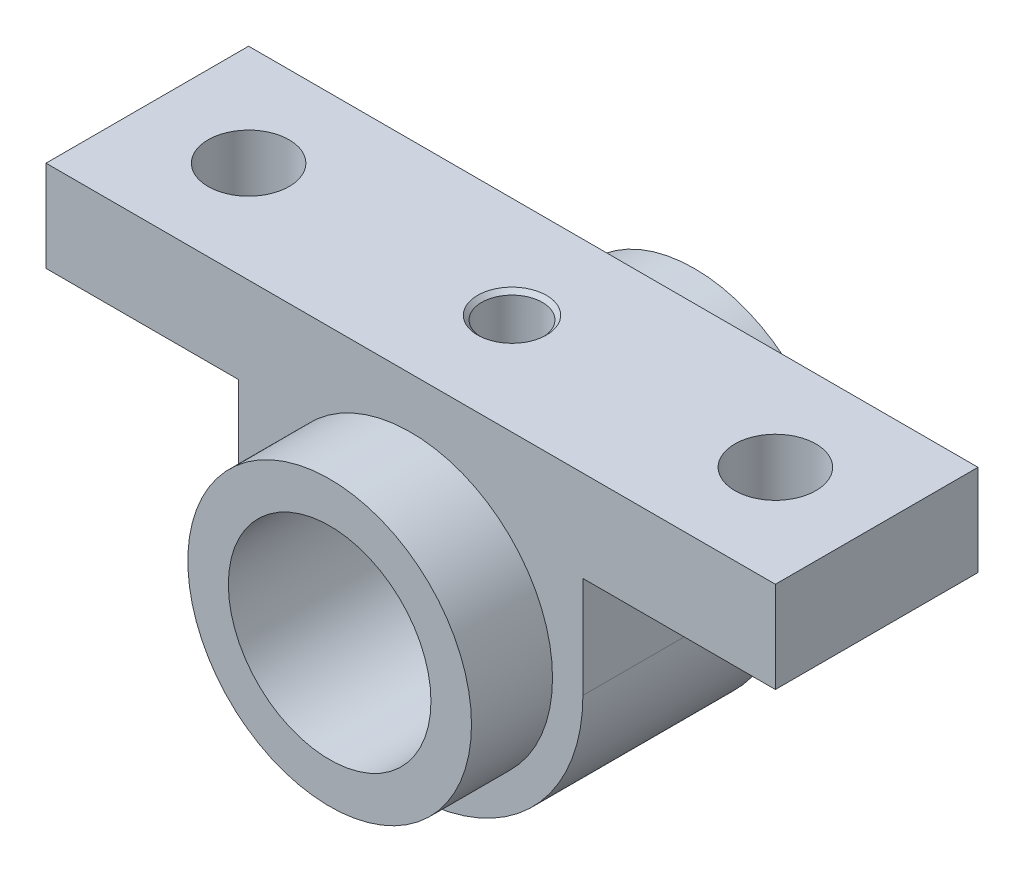
ISO-10303-21;
HEADER;
FILE_DESCRIPTION(('STEP AP214'),'2;1');
FILE_NAME('part.step','',(''),(''),'','','');
FILE_SCHEMA(('AUTOMOTIVE_DESIGN { 1 0 10303 214 1 1 1 1 }'));
ENDSEC;
DATA;
#1=APPLICATION_CONTEXT('core data for automotive mechanical design processes');
#2=APPLICATION_PROTOCOL_DEFINITION('international standard','automotive_design',2000,#1);
#3=PRODUCT_CONTEXT('',#1,'mechanical');
#4=PRODUCT('Part','Part','',(#3));
#5=PRODUCT_RELATED_PRODUCT_CATEGORY('part','',(#4));
#6=PRODUCT_DEFINITION_FORMATION('','',#4);
#7=PRODUCT_DEFINITION_CONTEXT('part definition',#1,'design');
#8=PRODUCT_DEFINITION('design','',#6,#7);
#9=PRODUCT_DEFINITION_SHAPE('','',#8);
#10=(LENGTH_UNIT() NAMED_UNIT(*) SI_UNIT(.MILLI.,.METRE.));
#11=(NAMED_UNIT(*) PLANE_ANGLE_UNIT() SI_UNIT($,.RADIAN.));
#12=(NAMED_UNIT(*) SI_UNIT($,.STERADIAN.) SOLID_ANGLE_UNIT());
#13=UNCERTAINTY_MEASURE_WITH_UNIT(LENGTH_MEASURE(1.E-05),#10,'distance_accuracy_value','');
#14=(GEOMETRIC_REPRESENTATION_CONTEXT(3) GLOBAL_UNCERTAINTY_ASSIGNED_CONTEXT((#13)) GLOBAL_UNIT_ASSIGNED_CONTEXT((#10,
#11,#12)) REPRESENTATION_CONTEXT('',''));
#15=CARTESIAN_POINT('',(0.,0.,0.));
#16=DIRECTION('',(0.,0.,1.));
#17=DIRECTION('',(1.,0.,0.));
#18=AXIS2_PLACEMENT_3D('',#15,#16,#17);
#19=CARTESIAN_POINT('',(18.,-9.5,0.));
#20=DIRECTION('',(0.,0.,1.));
#21=DIRECTION('',(1.,0.,0.));
#22=AXIS2_PLACEMENT_3D('',#19,#20,#21);
#23=PLANE('',#22);
#24=DIRECTION('',(0.,-1.,0.));
#25=VECTOR('',#24,1.);
#26=CARTESIAN_POINT('',(0.,0.,0.));
#27=LINE('',#26,#25);
#28=CARTESIAN_POINT('',(0.,0.,0.));
#29=VERTEX_POINT('',#28);
#30=CARTESIAN_POINT('',(0.,-4.5,0.));
#31=VERTEX_POINT('',#30);
#32=EDGE_CURVE('E143',#29,#31,#27,.T.);
#33=ORIENTED_EDGE('',*,*,#32,.F.);
#34=DIRECTION('',(-1.,0.,0.));
#35=VECTOR('',#34,1.);
#36=CARTESIAN_POINT('',(0.,0.,0.));
#37=LINE('',#36,#35);
#38=CARTESIAN_POINT('',(36.,0.,0.));
#39=VERTEX_POINT('',#38);
#40=EDGE_CURVE('E92',#39,#29,#37,.T.);
#41=ORIENTED_EDGE('',*,*,#40,.F.);
#42=DIRECTION('',(0.,1.,0.));
#43=VECTOR('',#42,1.);
#44=CARTESIAN_POINT('',(36.,0.,0.));
#45=LINE('',#44,#43);
#46=CARTESIAN_POINT('',(36.,-4.5,0.));
#47=VERTEX_POINT('',#46);
#48=EDGE_CURVE('E86',#47,#39,#45,.T.);
#49=ORIENTED_EDGE('',*,*,#48,.F.);
#50=DIRECTION('',(1.,0.,0.));
#51=VECTOR('',#50,1.);
#52=CARTESIAN_POINT('',(26.5,-4.5,0.));
#53=LINE('',#52,#51);
#54=CARTESIAN_POINT('',(26.5,-4.5,0.));
#55=VERTEX_POINT('',#54);
#56=EDGE_CURVE('E130',#55,#47,#53,.T.);
#57=ORIENTED_EDGE('',*,*,#56,.F.);
#58=DIRECTION('',(0.,1.,0.));
#59=VECTOR('',#58,1.);
#60=CARTESIAN_POINT('',(26.5,-9.5,0.));
#61=LINE('',#60,#59);
#62=CARTESIAN_POINT('',(26.5,-9.5,0.));
#63=VERTEX_POINT('',#62);
#64=EDGE_CURVE('E157',#63,#55,#61,.T.);
#65=ORIENTED_EDGE('',*,*,#64,.F.);
#66=CARTESIAN_POINT('',(18.,-9.5,0.));
#67=DIRECTION('',(0.,0.,1.));
#68=DIRECTION('',(1.,0.,0.));
#69=AXIS2_PLACEMENT_3D('',#66,#67,#68);
#70=CIRCLE('',#69,8.5);
#71=CARTESIAN_POINT('',(9.5,-9.5,0.));
#72=VERTEX_POINT('',#71);
#73=EDGE_CURVE('E154',#72,#63,#70,.T.);
#74=ORIENTED_EDGE('',*,*,#73,.F.);
#75=DIRECTION('',(0.,-1.,0.));
#76=VECTOR('',#75,1.);
#77=CARTESIAN_POINT('',(9.5,-4.5,0.));
#78=LINE('',#77,#76);
#79=CARTESIAN_POINT('',(9.5,-4.5,0.));
#80=VERTEX_POINT('',#79);
#81=EDGE_CURVE('E151',#80,#72,#78,.T.);
#82=ORIENTED_EDGE('',*,*,#81,.F.);
#83=DIRECTION('',(1.,0.,0.));
#84=VECTOR('',#83,1.);
#85=CARTESIAN_POINT('',(0.,-4.5,0.));
#86=LINE('',#85,#84);
#87=EDGE_CURVE('E147',#31,#80,#86,.T.);
#88=ORIENTED_EDGE('',*,*,#87,.F.);
#89=EDGE_LOOP('',(#33,#41,#49,#57,#65,#74,#82,#88));
#90=FACE_BOUND('',#89,.T.);
#91=CARTESIAN_POINT('',(18.,-9.5,0.));
#92=DIRECTION('',(0.,0.,1.));
#93=DIRECTION('',(1.,0.,0.));
#94=AXIS2_PLACEMENT_3D('',#91,#92,#93);
#95=CIRCLE('',#94,7.);
#96=CARTESIAN_POINT('',(25.,-9.5,0.));
#97=VERTEX_POINT('',#96);
#98=EDGE_CURVE('E188',#97,#97,#95,.F.);
#99=ORIENTED_EDGE('',*,*,#98,.F.);
#100=EDGE_LOOP('',(#99));
#101=FACE_BOUND('',#100,.T.);
#102=ADVANCED_FACE('F39',(#90,#101),#23,.F.);
#103=CARTESIAN_POINT('',(18.,-9.5,10.));
#104=DIRECTION('',(0.,0.,1.));
#105=DIRECTION('',(1.,0.,0.));
#106=AXIS2_PLACEMENT_3D('',#103,#104,#105);
#107=PLANE('',#106);
#108=DIRECTION('',(0.,-1.,0.));
#109=VECTOR('',#108,1.);
#110=CARTESIAN_POINT('',(0.,0.,10.));
#111=LINE('',#110,#109);
#112=CARTESIAN_POINT('',(0.,0.,10.));
#113=VERTEX_POINT('',#112);
#114=CARTESIAN_POINT('',(0.,-4.5,10.));
#115=VERTEX_POINT('',#114);
#116=EDGE_CURVE('E166',#113,#115,#111,.T.);
#117=ORIENTED_EDGE('',*,*,#116,.T.);
#118=DIRECTION('',(1.,0.,0.));
#119=VECTOR('',#118,1.);
#120=CARTESIAN_POINT('',(0.,-4.5,10.));
#121=LINE('',#120,#119);
#122=CARTESIAN_POINT('',(9.5,-4.5,10.));
#123=VERTEX_POINT('',#122);
#124=EDGE_CURVE('E101',#115,#123,#121,.T.);
#125=ORIENTED_EDGE('',*,*,#124,.T.);
#126=DIRECTION('',(0.,-1.,0.));
#127=VECTOR('',#126,1.);
#128=CARTESIAN_POINT('',(9.5,-4.5,10.));
#129=LINE('',#128,#127);
#130=CARTESIAN_POINT('',(9.5,-9.5,10.));
#131=VERTEX_POINT('',#130);
#132=EDGE_CURVE('E277',#123,#131,#129,.T.);
#133=ORIENTED_EDGE('',*,*,#132,.T.);
#134=CARTESIAN_POINT('',(18.,-9.5,10.));
#135=DIRECTION('',(0.,0.,1.));
#136=DIRECTION('',(1.,0.,0.));
#137=AXIS2_PLACEMENT_3D('',#134,#135,#136);
#138=CIRCLE('',#137,8.5);
#139=CARTESIAN_POINT('',(26.5,-9.5,10.));
#140=VERTEX_POINT('',#139);
#141=EDGE_CURVE('E280',#131,#140,#138,.T.);
#142=ORIENTED_EDGE('',*,*,#141,.T.);
#143=DIRECTION('',(0.,1.,0.));
#144=VECTOR('',#143,1.);
#145=CARTESIAN_POINT('',(26.5,-9.5,10.));
#146=LINE('',#145,#144);
#147=CARTESIAN_POINT('',(26.5,-4.5,10.));
#148=VERTEX_POINT('',#147);
#149=EDGE_CURVE('E121',#140,#148,#146,.T.);
#150=ORIENTED_EDGE('',*,*,#149,.T.);
#151=DIRECTION('',(1.,0.,0.));
#152=VECTOR('',#151,1.);
#153=CARTESIAN_POINT('',(26.5,-4.5,10.));
#154=LINE('',#153,#152);
#155=CARTESIAN_POINT('',(36.,-4.5,10.));
#156=VERTEX_POINT('',#155);
#157=EDGE_CURVE('E114',#148,#156,#154,.T.);
#158=ORIENTED_EDGE('',*,*,#157,.T.);
#159=DIRECTION('',(0.,1.,0.));
#160=VECTOR('',#159,1.);
#161=CARTESIAN_POINT('',(36.,0.,10.));
#162=LINE('',#161,#160);
#163=CARTESIAN_POINT('',(36.,0.,10.));
#164=VERTEX_POINT('',#163);
#165=EDGE_CURVE('E119',#156,#164,#162,.T.);
#166=ORIENTED_EDGE('',*,*,#165,.T.);
#167=DIRECTION('',(-1.,0.,0.));
#168=VECTOR('',#167,1.);
#169=CARTESIAN_POINT('',(0.,0.,10.));
#170=LINE('',#169,#168);
#171=EDGE_CURVE('E57',#164,#113,#170,.T.);
#172=ORIENTED_EDGE('',*,*,#171,.T.);
#173=EDGE_LOOP('',(#117,#125,#133,#142,#150,#158,#166,#172));
#174=FACE_BOUND('',#173,.T.);
#175=CARTESIAN_POINT('',(18.,-9.5,10.));
#176=DIRECTION('',(0.,0.,1.));
#177=DIRECTION('',(1.,0.,0.));
#178=AXIS2_PLACEMENT_3D('',#175,#176,#177);
#179=CIRCLE('',#178,7.);
#180=CARTESIAN_POINT('',(25.,-9.5,10.));
#181=VERTEX_POINT('',#180);
#182=EDGE_CURVE('E290',#181,#181,#179,.T.);
#183=ORIENTED_EDGE('',*,*,#182,.F.);
#184=EDGE_LOOP('',(#183));
#185=FACE_BOUND('',#184,.T.);
#186=ADVANCED_FACE('F116',(#174,#185),#107,.T.);
#187=CARTESIAN_POINT('',(0.,0.,10.));
#188=DIRECTION('',(1.,0.,0.));
#189=DIRECTION('',(0.,1.,0.));
#190=AXIS2_PLACEMENT_3D('',#187,#188,#189);
#191=PLANE('',#190);
#192=ORIENTED_EDGE('',*,*,#32,.T.);
#193=DIRECTION('',(0.,0.,-1.));
#194=VECTOR('',#193,1.);
#195=CARTESIAN_POINT('',(0.,-4.5,10.));
#196=LINE('',#195,#194);
#197=EDGE_CURVE('E185',#115,#31,#196,.T.);
#198=ORIENTED_EDGE('',*,*,#197,.F.);
#199=ORIENTED_EDGE('',*,*,#116,.F.);
#200=DIRECTION('',(0.,0.,-1.));
#201=VECTOR('',#200,1.);
#202=CARTESIAN_POINT('',(0.,0.,10.));
#203=LINE('',#202,#201);
#204=EDGE_CURVE('E139',#113,#29,#203,.T.);
#205=ORIENTED_EDGE('',*,*,#204,.T.);
#206=EDGE_LOOP('',(#192,#198,#199,#205));
#207=FACE_BOUND('',#206,.T.);
#208=ADVANCED_FACE('F239',(#207),#191,.F.);
#209=CARTESIAN_POINT('',(0.,-4.5,10.));
#210=DIRECTION('',(0.,1.,0.));
#211=DIRECTION('',(0.,0.,1.));
#212=AXIS2_PLACEMENT_3D('',#209,#210,#211);
#213=PLANE('',#212);
#214=CARTESIAN_POINT('',(5.,-4.5,5.));
#215=DIRECTION('',(0.,1.,0.));
#216=DIRECTION('',(0.,0.,1.));
#217=AXIS2_PLACEMENT_3D('',#214,#215,#216);
#218=CIRCLE('',#217,2.);
#219=CARTESIAN_POINT('',(5.,-4.5,7.));
#220=VERTEX_POINT('',#219);
#221=EDGE_CURVE('E200',#220,#220,#218,.T.);
#222=ORIENTED_EDGE('',*,*,#221,.T.);
#223=EDGE_LOOP('',(#222));
#224=FACE_BOUND('',#223,.T.);
#225=ORIENTED_EDGE('',*,*,#87,.T.);
#226=DIRECTION('',(0.,0.,-1.));
#227=VECTOR('',#226,1.);
#228=CARTESIAN_POINT('',(9.5,-4.5,10.));
#229=LINE('',#228,#227);
#230=EDGE_CURVE('E181',#123,#80,#229,.T.);
#231=ORIENTED_EDGE('',*,*,#230,.F.);
#232=ORIENTED_EDGE('',*,*,#124,.F.);
#233=ORIENTED_EDGE('',*,*,#197,.T.);
#234=EDGE_LOOP('',(#225,#231,#232,#233));
#235=FACE_BOUND('',#234,.T.);
#236=ADVANCED_FACE('F263',(#224,#235),#213,.F.);
#237=CARTESIAN_POINT('',(9.5,-4.5,10.));
#238=DIRECTION('',(1.,0.,0.));
#239=DIRECTION('',(0.,0.,-1.));
#240=AXIS2_PLACEMENT_3D('',#237,#238,#239);
#241=PLANE('',#240);
#242=ORIENTED_EDGE('',*,*,#81,.T.);
#243=DIRECTION('',(0.,0.,-1.));
#244=VECTOR('',#243,1.);
#245=CARTESIAN_POINT('',(9.5,-9.5,10.));
#246=LINE('',#245,#244);
#247=EDGE_CURVE('E177',#131,#72,#246,.T.);
#248=ORIENTED_EDGE('',*,*,#247,.F.);
#249=ORIENTED_EDGE('',*,*,#132,.F.);
#250=ORIENTED_EDGE('',*,*,#230,.T.);
#251=EDGE_LOOP('',(#242,#248,#249,#250));
#252=FACE_BOUND('',#251,.T.);
#253=ADVANCED_FACE('F259',(#252),#241,.F.);
#254=CARTESIAN_POINT('',(18.,-9.5,10.));
#255=DIRECTION('',(0.,0.,-1.));
#256=DIRECTION('',(-1.,0.,0.));
#257=AXIS2_PLACEMENT_3D('',#254,#255,#256);
#258=CYLINDRICAL_SURFACE('',#257,8.5);
#259=ORIENTED_EDGE('',*,*,#73,.T.);
#260=DIRECTION('',(0.,0.,-1.));
#261=VECTOR('',#260,1.);
#262=CARTESIAN_POINT('',(26.5,-9.5,10.));
#263=LINE('',#262,#261);
#264=EDGE_CURVE('E173',#140,#63,#263,.T.);
#265=ORIENTED_EDGE('',*,*,#264,.F.);
#266=ORIENTED_EDGE('',*,*,#141,.F.);
#267=ORIENTED_EDGE('',*,*,#247,.T.);
#268=EDGE_LOOP('',(#259,#265,#266,#267));
#269=FACE_BOUND('',#268,.T.);
#270=ADVANCED_FACE('F255',(#269),#258,.T.);
#271=CARTESIAN_POINT('',(26.5,-9.5,10.));
#272=DIRECTION('',(-1.,0.,0.));
#273=DIRECTION('',(0.,-1.,0.));
#274=AXIS2_PLACEMENT_3D('',#271,#272,#273);
#275=PLANE('',#274);
#276=ORIENTED_EDGE('',*,*,#64,.T.);
#277=DIRECTION('',(0.,0.,-1.));
#278=VECTOR('',#277,1.);
#279=CARTESIAN_POINT('',(26.5,-4.5,10.));
#280=LINE('',#279,#278);
#281=EDGE_CURVE('E132',#148,#55,#280,.T.);
#282=ORIENTED_EDGE('',*,*,#281,.F.);
#283=ORIENTED_EDGE('',*,*,#149,.F.);
#284=ORIENTED_EDGE('',*,*,#264,.T.);
#285=EDGE_LOOP('',(#276,#282,#283,#284));
#286=FACE_BOUND('',#285,.T.);
#287=ADVANCED_FACE('F251',(#286),#275,.F.);
#288=CARTESIAN_POINT('',(26.5,-4.5,10.));
#289=DIRECTION('',(0.,1.,0.));
#290=DIRECTION('',(0.,0.,1.));
#291=AXIS2_PLACEMENT_3D('',#288,#289,#290);
#292=PLANE('',#291);
#293=CARTESIAN_POINT('',(31.,-4.5,5.));
#294=DIRECTION('',(0.,1.,0.));
#295=DIRECTION('',(0.,0.,1.));
#296=AXIS2_PLACEMENT_3D('',#293,#294,#295);
#297=CIRCLE('',#296,2.);
#298=CARTESIAN_POINT('',(31.,-4.5,7.));
#299=VERTEX_POINT('',#298);
#300=EDGE_CURVE('E309',#299,#299,#297,.T.);
#301=ORIENTED_EDGE('',*,*,#300,.T.);
#302=EDGE_LOOP('',(#301));
#303=FACE_BOUND('',#302,.T.);
#304=ORIENTED_EDGE('',*,*,#56,.T.);
#305=DIRECTION('',(0.,0.,-1.));
#306=VECTOR('',#305,1.);
#307=CARTESIAN_POINT('',(36.,-4.5,10.));
#308=LINE('',#307,#306);
#309=EDGE_CURVE('E127',#156,#47,#308,.T.);
#310=ORIENTED_EDGE('',*,*,#309,.F.);
#311=ORIENTED_EDGE('',*,*,#157,.F.);
#312=ORIENTED_EDGE('',*,*,#281,.T.);
#313=EDGE_LOOP('',(#304,#310,#311,#312));
#314=FACE_BOUND('',#313,.T.);
#315=ADVANCED_FACE('F128',(#303,#314),#292,.F.);
#316=CARTESIAN_POINT('',(36.,0.,10.));
#317=DIRECTION('',(-1.,0.,0.));
#318=DIRECTION('',(0.,0.,1.));
#319=AXIS2_PLACEMENT_3D('',#316,#317,#318);
#320=PLANE('',#319);
#321=ORIENTED_EDGE('',*,*,#48,.T.);
#322=DIRECTION('',(0.,0.,-1.));
#323=VECTOR('',#322,1.);
#324=CARTESIAN_POINT('',(36.,0.,10.));
#325=LINE('',#324,#323);
#326=EDGE_CURVE('E133',#164,#39,#325,.T.);
#327=ORIENTED_EDGE('',*,*,#326,.F.);
#328=ORIENTED_EDGE('',*,*,#165,.F.);
#329=ORIENTED_EDGE('',*,*,#309,.T.);
#330=EDGE_LOOP('',(#321,#327,#328,#329));
#331=FACE_BOUND('',#330,.T.);
#332=ADVANCED_FACE('F135',(#331),#320,.F.);
#333=CARTESIAN_POINT('',(0.,0.,10.));
#334=DIRECTION('',(0.,-1.,0.));
#335=DIRECTION('',(0.,0.,-1.));
#336=AXIS2_PLACEMENT_3D('',#333,#334,#335);
#337=PLANE('',#336);
#338=CARTESIAN_POINT('',(18.,0.,5.));
#339=DIRECTION('',(0.,-1.,0.));
#340=DIRECTION('',(0.,0.,-1.));
#341=AXIS2_PLACEMENT_3D('',#338,#339,#340);
#342=CIRCLE('',#341,1.7);
#343=CARTESIAN_POINT('',(18.,0.,3.3));
#344=VERTEX_POINT('',#343);
#345=EDGE_CURVE('E11',#344,#344,#342,.T.);
#346=ORIENTED_EDGE('',*,*,#345,.T.);
#347=EDGE_LOOP('',(#346));
#348=FACE_BOUND('',#347,.T.);
#349=CARTESIAN_POINT('',(31.,0.,5.));
#350=DIRECTION('',(0.,1.,0.));
#351=DIRECTION('',(0.,0.,1.));
#352=AXIS2_PLACEMENT_3D('',#349,#350,#351);
#353=CIRCLE('',#352,2.);
#354=CARTESIAN_POINT('',(31.,0.,7.));
#355=VERTEX_POINT('',#354);
#356=EDGE_CURVE('E316',#355,#355,#353,.T.);
#357=ORIENTED_EDGE('',*,*,#356,.F.);
#358=EDGE_LOOP('',(#357));
#359=FACE_BOUND('',#358,.T.);
#360=CARTESIAN_POINT('',(5.,0.,5.));
#361=DIRECTION('',(0.,1.,0.));
#362=DIRECTION('',(0.,0.,1.));
#363=AXIS2_PLACEMENT_3D('',#360,#361,#362);
#364=CIRCLE('',#363,2.);
#365=CARTESIAN_POINT('',(5.,0.,7.));
#366=VERTEX_POINT('',#365);
#367=EDGE_CURVE('E201',#366,#366,#364,.T.);
#368=ORIENTED_EDGE('',*,*,#367,.F.);
#369=EDGE_LOOP('',(#368));
#370=FACE_BOUND('',#369,.T.);
#371=ORIENTED_EDGE('',*,*,#40,.T.);
#372=ORIENTED_EDGE('',*,*,#204,.F.);
#373=ORIENTED_EDGE('',*,*,#171,.F.);
#374=ORIENTED_EDGE('',*,*,#326,.T.);
#375=EDGE_LOOP('',(#371,#372,#373,#374));
#376=FACE_BOUND('',#375,.T.);
#377=ADVANCED_FACE('F243',(#348,#359,#370,#376),#337,.F.);
#378=CARTESIAN_POINT('',(18.,-9.5,10.));
#379=DIRECTION('',(0.,0.,-1.));
#380=DIRECTION('',(-1.,0.,0.));
#381=AXIS2_PLACEMENT_3D('',#378,#379,#380);
#382=CYLINDRICAL_SURFACE('',#381,5.);
#383=CARTESIAN_POINT('',(18.,-4.5,6.5));
#384=CARTESIAN_POINT('',(17.9177113872467,-4.5000007074945,6.49999900251511));
#385=CARTESIAN_POINT('',(17.8354126816485,-4.50205084306046,6.49320613637603));
#386=CARTESIAN_POINT('',(17.6732118746951,-4.51002894406309,6.4662786457779));
#387=CARTESIAN_POINT('',(17.5933104955886,-4.51595806610308,6.44614004197666));
#388=CARTESIAN_POINT('',(17.4382672922455,-4.53104447498163,6.39325398308974));
#389=CARTESIAN_POINT('',(17.3631186356046,-4.54019699749574,6.36052513038106));
#390=CARTESIAN_POINT('',(17.2193758189469,-4.56077890762354,6.28346390694417));
#391=CARTESIAN_POINT('',(17.1507825325303,-4.57220859807933,6.23912999260459));
#392=CARTESIAN_POINT('',(17.0201282028163,-4.59649262807226,6.13877599252733));
#393=CARTESIAN_POINT('',(16.9582819287557,-4.60937616342964,6.08248337411409));
#394=CARTESIAN_POINT('',(16.8447507907668,-4.63494165789558,5.96039077008982));
#395=CARTESIAN_POINT('',(16.7930676367256,-4.64762358275498,5.89458918787504));
#396=CARTESIAN_POINT('',(16.7001996227629,-4.67165886006228,5.75352924696239));
#397=CARTESIAN_POINT('',(16.6592769097779,-4.68297593336125,5.67809153900926));
#398=CARTESIAN_POINT('',(16.5907860522524,-4.70256379605969,5.52101074576971));
#399=CARTESIAN_POINT('',(16.5632147008003,-4.71083531686689,5.43936915607202));
#400=CARTESIAN_POINT('',(16.5229836631735,-4.72309129161566,5.27460973386954));
#401=CARTESIAN_POINT('',(16.5099280376532,-4.72718930675466,5.19159725613606));
#402=CARTESIAN_POINT('',(16.4978626938533,-4.73097210250233,5.02446684378323));
#403=CARTESIAN_POINT('',(16.4988495723892,-4.73065795239429,4.94034918194091));
#404=CARTESIAN_POINT('',(16.5145302280019,-4.72575255932222,4.77661609139152));
#405=CARTESIAN_POINT('',(16.5287279473731,-4.72131611400859,4.69694774963776));
#406=CARTESIAN_POINT('',(16.5696257957294,-4.70891643771376,4.54118021372654));
#407=CARTESIAN_POINT('',(16.5963271585836,-4.70095285867649,4.46508137262567));
#408=CARTESIAN_POINT('',(16.6618397334632,-4.68227266925027,4.31739965033926));
#409=CARTESIAN_POINT('',(16.7008118306536,-4.67151983884048,4.24589291604474));
#410=CARTESIAN_POINT('',(16.7896477741132,-4.64849012999935,4.11026797798981));
#411=CARTESIAN_POINT('',(16.8395142599741,-4.63621288253009,4.04615157058622));
#412=CARTESIAN_POINT('',(16.9511870923445,-4.61088988702063,3.92431380923798));
#413=CARTESIAN_POINT('',(17.013405092533,-4.59783345689502,3.86697133597033));
#414=CARTESIAN_POINT('',(17.146736740686,-4.57287755936741,3.76344601593575));
#415=CARTESIAN_POINT('',(17.2178509481391,-4.5609781648159,3.71726387158557));
#416=CARTESIAN_POINT('',(17.3676449616572,-4.5395683993053,3.63714007753527));
#417=CARTESIAN_POINT('',(17.4463722502521,-4.53007456331686,3.60328248375014));
#418=CARTESIAN_POINT('',(17.6087545843965,-4.51466478167778,3.54940040990037));
#419=CARTESIAN_POINT('',(17.6924082484104,-4.50874783813001,3.52937207146751));
#420=CARTESIAN_POINT('',(17.8590477573317,-4.50131635356462,3.50434782210061));
#421=CARTESIAN_POINT('',(17.9419499023988,-4.4996514958221,3.49883841419839));
#422=CARTESIAN_POINT('',(18.1074996058234,-4.5004707675824,3.50156915571208));
#423=CARTESIAN_POINT('',(18.1901471966908,-4.50295434322243,3.50980746965144));
#424=CARTESIAN_POINT('',(18.3509036053097,-4.51169303012837,3.5393846111115));
#425=CARTESIAN_POINT('',(18.4290727726142,-4.51786170200583,3.56042338758087));
#426=CARTESIAN_POINT('',(18.5807546389545,-4.53325652158467,3.6146432327782));
#427=CARTESIAN_POINT('',(18.6542667770256,-4.54248303678915,3.64782576103786));
#428=CARTESIAN_POINT('',(18.7964371894611,-4.56330345648675,3.72625316548113));
#429=CARTESIAN_POINT('',(18.8649438261997,-4.57494719170325,3.77175934094797));
#430=CARTESIAN_POINT('',(18.9935233079801,-4.59926531235682,3.87322475405281));
#431=CARTESIAN_POINT('',(19.0535940323559,-4.6119399556892,3.92918661188767));
#432=CARTESIAN_POINT('',(19.1658574455103,-4.63746828130862,4.05238730836935));
#433=CARTESIAN_POINT('',(19.217684812315,-4.65031174966732,4.11996187577174));
#434=CARTESIAN_POINT('',(19.3092899507215,-4.67423484761536,4.26312793901353));
#435=CARTESIAN_POINT('',(19.3490680382947,-4.68531452345349,4.33871922455822));
#436=CARTESIAN_POINT('',(19.4151734712717,-4.70432810384945,4.49553249125469));
#437=CARTESIAN_POINT('',(19.4415634693705,-4.71227662156173,4.57672618653659));
#438=CARTESIAN_POINT('',(19.4802173081511,-4.72408405637206,4.74268796893148));
#439=CARTESIAN_POINT('',(19.4924859897878,-4.72794437491699,4.82745482078767));
#440=CARTESIAN_POINT('',(19.5022198448506,-4.73100027503913,4.99436151837623));
#441=CARTESIAN_POINT('',(19.5002805530849,-4.73038352557246,5.07646365101759));
#442=CARTESIAN_POINT('',(19.4830750544481,-4.72500598711706,5.2391141033728));
#443=CARTESIAN_POINT('',(19.4678093812472,-4.72024536407449,5.31966248517636));
#444=CARTESIAN_POINT('',(19.4247688880414,-4.70724236329614,5.47594539914285));
#445=CARTESIAN_POINT('',(19.3971517550707,-4.69904395454035,5.5517272873617));
#446=CARTESIAN_POINT('',(19.3303150712113,-4.68009721090864,5.69764243881773));
#447=CARTESIAN_POINT('',(19.2910932996288,-4.66934838805688,5.76777461764076));
#448=CARTESIAN_POINT('',(19.2004876380507,-4.64602323574167,5.90316311652711));
#449=CARTESIAN_POINT('',(19.1487127609299,-4.63339459836202,5.96814876126041));
#450=CARTESIAN_POINT('',(19.0351743462978,-4.60798679549974,6.08870249830786));
#451=CARTESIAN_POINT('',(18.9734082171345,-4.59520759176095,6.14426813946776));
#452=CARTESIAN_POINT('',(18.8394657621832,-4.57049063429351,6.24602341229503));
#453=CARTESIAN_POINT('',(18.7670378857906,-4.55858840234326,6.29189144685549));
#454=CARTESIAN_POINT('',(18.6151413739835,-4.53739319544187,6.37073516990403));
#455=CARTESIAN_POINT('',(18.535676052999,-4.52809900068933,6.40371688827451));
#456=CARTESIAN_POINT('',(18.3807577126553,-4.51397825030699,6.45289527565275));
#457=CARTESIAN_POINT('',(18.3057869619542,-4.50877972618932,6.47051167288325));
#458=CARTESIAN_POINT('',(18.1538801952308,-4.50179055505508,6.49406352524158));
#459=CARTESIAN_POINT('',(18.0769445098581,-4.4999993384526,6.50000093270482));
#460=CARTESIAN_POINT('',(18.,-4.5,6.5));
#461=B_SPLINE_CURVE_WITH_KNOTS('',3,(#383,#384,#385,#386,#387,#388,#389,#390,#391,#392,#393,
#394,#395,#396,#397,#398,#399,#400,#401,#402,#403,#404,#405,#406,#407,#408,#409,#410,#411,#412,
#413,#414,#415,#416,#417,#418,#419,#420,#421,#422,#423,#424,#425,#426,#427,#428,#429,#430,#431,
#432,#433,#434,#435,#436,#437,#438,#439,#440,#441,#442,#443,#444,#445,#446,#447,#448,#449,#450,
#451,#452,#453,#454,#455,#456,#457,#458,#459,#460),.UNSPECIFIED.,.T.,.F.,(4,2,2,2,2,2,2,2,2,2,2,
2,2,2,2,2,2,2,2,2,2,2,2,2,2,2,2,2,2,2,2,2,2,2,2,2,2,2,4),(0.,0.246583203612611,
0.493239964846001,0.739533676300873,0.985860164412701,1.23855602948192,1.49129437288633,
1.74971481004109,2.00807314543224,2.25919689356599,2.51025978319089,2.75226016697676,
2.99428443658001,3.2396242644712,3.48502360158555,3.74067104048167,3.99633456531072,
4.25371046881689,4.51101453528808,4.75908809438545,5.00712853550327,5.24956746682327,
5.49203554593729,5.74011305702909,5.98825282000191,6.24540400322819,6.50254844252681,
6.75847814951252,7.01432009460283,7.25950155466943,7.504673196616,7.74680040402722,
7.98897397553108,8.23996925679931,8.49102974897503,8.74942996156672,9.00770911595236,
9.2383169193046,9.46888616948875),.UNSPECIFIED.);
#462=CARTESIAN_POINT('',(18.,-4.5,6.5));
#463=VERTEX_POINT('',#462);
#464=EDGE_CURVE('E192',#463,#463,#461,.T.);
#465=ORIENTED_EDGE('',*,*,#464,.F.);
#466=EDGE_LOOP('',(#465));
#467=FACE_BOUND('',#466,.T.);
#468=CARTESIAN_POINT('',(18.,-9.5,14.));
#469=DIRECTION('',(0.,0.,1.));
#470=DIRECTION('',(1.,0.,0.));
#471=AXIS2_PLACEMENT_3D('',#468,#469,#470);
#472=CIRCLE('',#471,5.);
#473=CARTESIAN_POINT('',(23.,-9.5,14.));
#474=VERTEX_POINT('',#473);
#475=EDGE_CURVE('E294',#474,#474,#472,.T.);
#476=ORIENTED_EDGE('',*,*,#475,.T.);
#477=EDGE_LOOP('',(#476));
#478=FACE_BOUND('',#477,.T.);
#479=CARTESIAN_POINT('',(18.,-9.5,-4.));
#480=DIRECTION('',(0.,0.,-1.));
#481=DIRECTION('',(-1.,0.,0.));
#482=AXIS2_PLACEMENT_3D('',#479,#480,#481);
#483=CIRCLE('',#482,5.);
#484=CARTESIAN_POINT('',(13.,-9.5,-4.));
#485=VERTEX_POINT('',#484);
#486=EDGE_CURVE('E305',#485,#485,#483,.T.);
#487=ORIENTED_EDGE('',*,*,#486,.T.);
#488=EDGE_LOOP('',(#487));
#489=FACE_BOUND('',#488,.T.);
#490=ADVANCED_FACE('F202',(#467,#478,#489),#382,.F.);
#491=CARTESIAN_POINT('',(18.,-9.5,14.));
#492=DIRECTION('',(0.,0.,1.));
#493=DIRECTION('',(1.,0.,0.));
#494=AXIS2_PLACEMENT_3D('',#491,#492,#493);
#495=PLANE('',#494);
#496=CARTESIAN_POINT('',(18.,-9.5,14.));
#497=DIRECTION('',(0.,0.,1.));
#498=DIRECTION('',(1.,0.,0.));
#499=AXIS2_PLACEMENT_3D('',#496,#497,#498);
#500=CIRCLE('',#499,7.);
#501=CARTESIAN_POINT('',(25.,-9.5,14.));
#502=VERTEX_POINT('',#501);
#503=EDGE_CURVE('E148',#502,#502,#500,.T.);
#504=ORIENTED_EDGE('',*,*,#503,.T.);
#505=EDGE_LOOP('',(#504));
#506=FACE_BOUND('',#505,.T.);
#507=ORIENTED_EDGE('',*,*,#475,.F.);
#508=EDGE_LOOP('',(#507));
#509=FACE_BOUND('',#508,.T.);
#510=ADVANCED_FACE('F224',(#506,#509),#495,.T.);
#511=CARTESIAN_POINT('',(18.,-9.5,14.));
#512=DIRECTION('',(0.,0.,-1.));
#513=DIRECTION('',(-1.,0.,0.));
#514=AXIS2_PLACEMENT_3D('',#511,#512,#513);
#515=CYLINDRICAL_SURFACE('',#514,7.);
#516=ORIENTED_EDGE('',*,*,#503,.F.);
#517=EDGE_LOOP('',(#516));
#518=FACE_BOUND('',#517,.T.);
#519=ORIENTED_EDGE('',*,*,#182,.T.);
#520=EDGE_LOOP('',(#519));
#521=FACE_BOUND('',#520,.T.);
#522=ADVANCED_FACE('F219',(#518,#521),#515,.T.);
#523=CARTESIAN_POINT('',(18.,-9.5,-4.));
#524=DIRECTION('',(0.,0.,-1.));
#525=DIRECTION('',(-1.,0.,0.));
#526=AXIS2_PLACEMENT_3D('',#523,#524,#525);
#527=PLANE('',#526);
#528=CARTESIAN_POINT('',(18.,-9.5,-4.));
#529=DIRECTION('',(0.,0.,-1.));
#530=DIRECTION('',(-1.,0.,0.));
#531=AXIS2_PLACEMENT_3D('',#528,#529,#530);
#532=CIRCLE('',#531,7.);
#533=CARTESIAN_POINT('',(11.,-9.5,-4.));
#534=VERTEX_POINT('',#533);
#535=EDGE_CURVE('E301',#534,#534,#532,.T.);
#536=ORIENTED_EDGE('',*,*,#535,.T.);
#537=EDGE_LOOP('',(#536));
#538=FACE_BOUND('',#537,.T.);
#539=ORIENTED_EDGE('',*,*,#486,.F.);
#540=EDGE_LOOP('',(#539));
#541=FACE_BOUND('',#540,.T.);
#542=ADVANCED_FACE('F216',(#538,#541),#527,.T.);
#543=CARTESIAN_POINT('',(18.,-9.5,-4.));
#544=DIRECTION('',(0.,0.,1.));
#545=DIRECTION('',(1.,0.,0.));
#546=AXIS2_PLACEMENT_3D('',#543,#544,#545);
#547=CYLINDRICAL_SURFACE('',#546,7.);
#548=ORIENTED_EDGE('',*,*,#535,.F.);
#549=EDGE_LOOP('',(#548));
#550=FACE_BOUND('',#549,.T.);
#551=ORIENTED_EDGE('',*,*,#98,.T.);
#552=EDGE_LOOP('',(#551));
#553=FACE_BOUND('',#552,.T.);
#554=ADVANCED_FACE('F212',(#550,#553),#547,.T.);
#555=CARTESIAN_POINT('',(18.,-7.,5.));
#556=DIRECTION('',(0.,1.,0.));
#557=DIRECTION('',(0.,0.,1.));
#558=AXIS2_PLACEMENT_3D('',#555,#556,#557);
#559=CYLINDRICAL_SURFACE('',#558,1.5);
#560=CARTESIAN_POINT('',(18.,-0.200000000000001,5.));
#561=DIRECTION('',(0.,-1.,0.));
#562=DIRECTION('',(0.,0.,-1.));
#563=AXIS2_PLACEMENT_3D('',#560,#561,#562);
#564=CIRCLE('',#563,1.5);
#565=CARTESIAN_POINT('',(18.,-0.200000000000001,3.5));
#566=VERTEX_POINT('',#565);
#567=EDGE_CURVE('E49',#566,#566,#564,.F.);
#568=ORIENTED_EDGE('',*,*,#567,.T.);
#569=EDGE_LOOP('',(#568));
#570=FACE_BOUND('',#569,.T.);
#571=ORIENTED_EDGE('',*,*,#464,.T.);
#572=EDGE_LOOP('',(#571));
#573=FACE_BOUND('',#572,.T.);
#574=ADVANCED_FACE('F206',(#570,#573),#559,.F.);
#575=CARTESIAN_POINT('',(5.,-7.,5.));
#576=DIRECTION('',(0.,1.,0.));
#577=DIRECTION('',(0.,0.,1.));
#578=AXIS2_PLACEMENT_3D('',#575,#576,#577);
#579=CYLINDRICAL_SURFACE('',#578,2.);
#580=ORIENTED_EDGE('',*,*,#367,.T.);
#581=EDGE_LOOP('',(#580));
#582=FACE_BOUND('',#581,.T.);
#583=ORIENTED_EDGE('',*,*,#221,.F.);
#584=EDGE_LOOP('',(#583));
#585=FACE_BOUND('',#584,.T.);
#586=ADVANCED_FACE('F211',(#582,#585),#579,.F.);
#587=CARTESIAN_POINT('',(31.,-7.,5.));
#588=DIRECTION('',(0.,1.,0.));
#589=DIRECTION('',(0.,0.,1.));
#590=AXIS2_PLACEMENT_3D('',#587,#588,#589);
#591=CYLINDRICAL_SURFACE('',#590,2.);
#592=ORIENTED_EDGE('',*,*,#356,.T.);
#593=EDGE_LOOP('',(#592));
#594=FACE_BOUND('',#593,.T.);
#595=ORIENTED_EDGE('',*,*,#300,.F.);
#596=EDGE_LOOP('',(#595));
#597=FACE_BOUND('',#596,.T.);
#598=ADVANCED_FACE('F214',(#594,#597),#591,.F.);
#599=CARTESIAN_POINT('',(18.,-0.200000000000001,5.));
#600=DIRECTION('',(0.,1.,0.));
#601=DIRECTION('',(0.,0.,1.));
#602=AXIS2_PLACEMENT_3D('',#599,#600,#601);
#603=CONICAL_SURFACE('',#602,1.5,0.785398163397443);
#604=ORIENTED_EDGE('',*,*,#345,.F.);
#605=EDGE_LOOP('',(#604));
#606=FACE_BOUND('',#605,.T.);
#607=ORIENTED_EDGE('',*,*,#567,.F.);
#608=EDGE_LOOP('',(#607));
#609=FACE_BOUND('',#608,.T.);
#610=ADVANCED_FACE('F41',(#606,#609),#603,.F.);
#611=CLOSED_SHELL('',(#102,#186,#208,#236,#253,#270,#287,#315,#332,#377,#490,#510,#522,#542,
#554,#574,#586,#598,#610));
#612=MANIFOLD_SOLID_BREP('B2',#611);
#613=ADVANCED_BREP_SHAPE_REPRESENTATION('',(#18,#612),#14);
#614=SHAPE_DEFINITION_REPRESENTATION(#9,#613);
ENDSEC;
END-ISO-10303-21;
